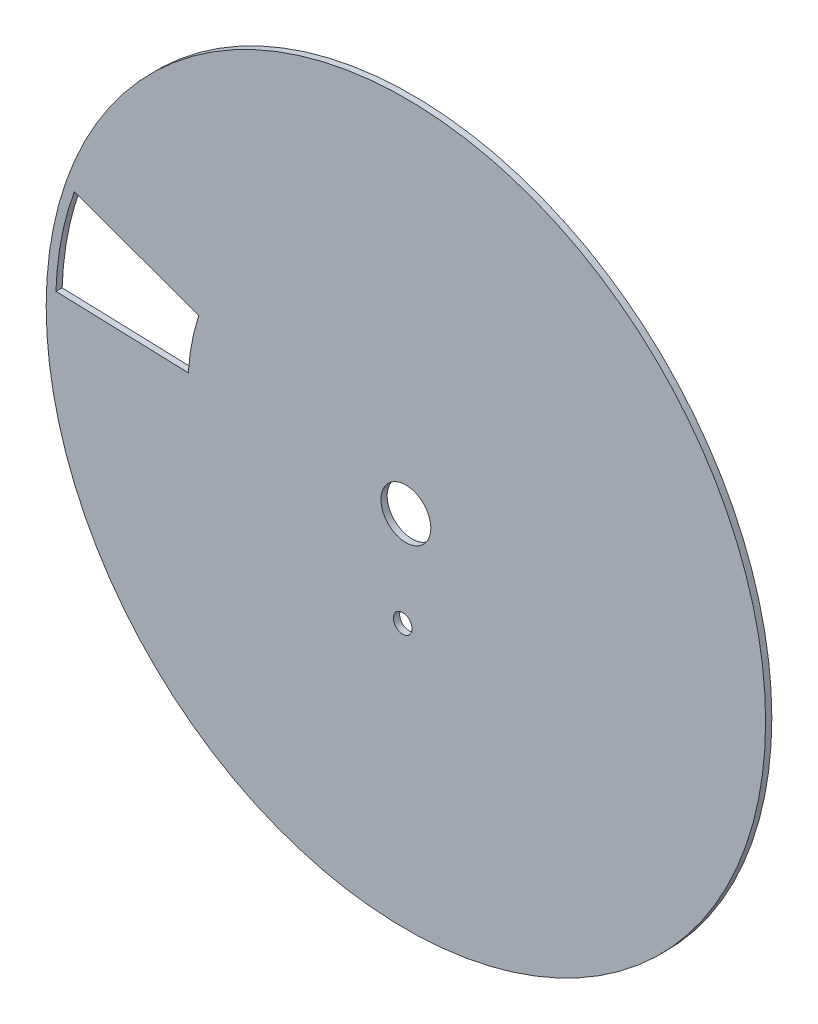
ISO-10303-21;
HEADER;
FILE_DESCRIPTION(('STEP AP214'),'2;1');
FILE_NAME('part.step','',(''),(''),'','','');
FILE_SCHEMA(('AUTOMOTIVE_DESIGN { 1 0 10303 214 1 1 1 1 }'));
ENDSEC;
DATA;
#1=APPLICATION_CONTEXT('core data for automotive mechanical design processes');
#2=APPLICATION_PROTOCOL_DEFINITION('international standard','automotive_design',2000,#1);
#3=PRODUCT_CONTEXT('',#1,'mechanical');
#4=PRODUCT('Part','Part','',(#3));
#5=PRODUCT_RELATED_PRODUCT_CATEGORY('part','',(#4));
#6=PRODUCT_DEFINITION_FORMATION('','',#4);
#7=PRODUCT_DEFINITION_CONTEXT('part definition',#1,'design');
#8=PRODUCT_DEFINITION('design','',#6,#7);
#9=PRODUCT_DEFINITION_SHAPE('','',#8);
#10=(LENGTH_UNIT() NAMED_UNIT(*) SI_UNIT(.MILLI.,.METRE.));
#11=(NAMED_UNIT(*) PLANE_ANGLE_UNIT() SI_UNIT($,.RADIAN.));
#12=(NAMED_UNIT(*) SI_UNIT($,.STERADIAN.) SOLID_ANGLE_UNIT());
#13=UNCERTAINTY_MEASURE_WITH_UNIT(LENGTH_MEASURE(1.E-05),#10,'distance_accuracy_value','');
#14=(GEOMETRIC_REPRESENTATION_CONTEXT(3) GLOBAL_UNCERTAINTY_ASSIGNED_CONTEXT((#13)) GLOBAL_UNIT_ASSIGNED_CONTEXT((#10,
#11,#12)) REPRESENTATION_CONTEXT('',''));
#15=CARTESIAN_POINT('',(0.,0.,0.));
#16=DIRECTION('',(0.,0.,1.));
#17=DIRECTION('',(1.,0.,0.));
#18=AXIS2_PLACEMENT_3D('',#15,#16,#17);
#19=CARTESIAN_POINT('',(0.,0.,1.));
#20=DIRECTION('',(0.,0.,-1.));
#21=DIRECTION('',(-1.,0.,0.));
#22=AXIS2_PLACEMENT_3D('',#19,#20,#21);
#23=CYLINDRICAL_SURFACE('',#22,57.75);
#24=CARTESIAN_POINT('',(0.,0.,1.));
#25=DIRECTION('',(0.,0.,1.));
#26=DIRECTION('',(1.,0.,0.));
#27=AXIS2_PLACEMENT_3D('',#24,#25,#26);
#28=CIRCLE('',#27,57.75);
#29=CARTESIAN_POINT('',(57.75,0.,1.));
#30=VERTEX_POINT('',#29);
#31=EDGE_CURVE('E11',#30,#30,#28,.T.);
#32=ORIENTED_EDGE('',*,*,#31,.F.);
#33=EDGE_LOOP('',(#32));
#34=FACE_BOUND('',#33,.T.);
#35=CARTESIAN_POINT('',(0.,0.,0.));
#36=DIRECTION('',(0.,0.,1.));
#37=DIRECTION('',(1.,0.,0.));
#38=AXIS2_PLACEMENT_3D('',#35,#36,#37);
#39=CIRCLE('',#38,57.75);
#40=CARTESIAN_POINT('',(57.75,0.,0.));
#41=VERTEX_POINT('',#40);
#42=EDGE_CURVE('E43',#41,#41,#39,.T.);
#43=ORIENTED_EDGE('',*,*,#42,.T.);
#44=EDGE_LOOP('',(#43));
#45=FACE_BOUND('',#44,.T.);
#46=ADVANCED_FACE('F35',(#34,#45),#23,.T.);
#47=CARTESIAN_POINT('',(0.,0.,1.));
#48=DIRECTION('',(0.,0.,1.));
#49=DIRECTION('',(1.,0.,0.));
#50=AXIS2_PLACEMENT_3D('',#47,#48,#49);
#51=PLANE('',#50);
#52=CARTESIAN_POINT('',(-0.504599233809029,-15.4957912313643,0.999999999999999));
#53=DIRECTION('',(0.,0.,1.));
#54=DIRECTION('',(1.,0.,0.));
#55=AXIS2_PLACEMENT_3D('',#52,#53,#54);
#56=CIRCLE('',#55,1.5);
#57=CARTESIAN_POINT('',(0.995400766190971,-15.4957912313643,0.999999999999999));
#58=VERTEX_POINT('',#57);
#59=EDGE_CURVE('E148',#58,#58,#56,.T.);
#60=ORIENTED_EDGE('',*,*,#59,.F.);
#61=EDGE_LOOP('',(#60));
#62=FACE_BOUND('',#61,.T.);
#63=CARTESIAN_POINT('',(6.82093270754081E-12,-1.27241966962899E-12,0.999999999999999));
#64=DIRECTION('',(0.,0.,1.));
#65=DIRECTION('',(1.,0.,0.));
#66=AXIS2_PLACEMENT_3D('',#63,#64,#65);
#67=CIRCLE('',#66,35.0000000000069);
#68=CARTESIAN_POINT('',(-34.9346304772887,2.13812848427975,0.999999999999999));
#69=VERTEX_POINT('',#68);
#70=CARTESIAN_POINT('',(-33.2437033861804,10.9478849633919,0.999999999999999));
#71=VERTEX_POINT('',#70);
#72=EDGE_CURVE('E110',#69,#71,#67,.F.);
#73=ORIENTED_EDGE('',*,*,#72,.F.);
#74=DIRECTION('',(0.999470226243168,-0.0325463800357249,0.));
#75=VECTOR('',#74,1.);
#76=CARTESIAN_POINT('',(0.0325463800356788,0.999470226241753,1.));
#77=LINE('',#76,#75);
#78=CARTESIAN_POINT('',(-56.1846304772888,2.83010565138236,1.));
#79=VERTEX_POINT('',#78);
#80=EDGE_CURVE('E103',#79,#69,#77,.T.);
#81=ORIENTED_EDGE('',*,*,#80,.F.);
#82=CARTESIAN_POINT('',(-6.30574227167811,1.17366882078777,0.999999999999999));
#83=DIRECTION('',(0.,0.,1.));
#84=DIRECTION('',(1.,0.,0.));
#85=AXIS2_PLACEMENT_3D('',#82,#83,#84);
#86=CIRCLE('',#85,49.9063850784802);
#87=CARTESIAN_POINT('',(-53.2292282344019,18.1687780204256,0.999999999999999));
#88=VERTEX_POINT('',#87);
#89=EDGE_CURVE('E83',#88,#79,#86,.T.);
#90=ORIENTED_EDGE('',*,*,#89,.F.);
#91=DIRECTION('',(-0.940495286975132,0.339806732095707,0.));
#92=VECTOR('',#91,1.);
#93=CARTESIAN_POINT('',(-0.339806732096038,-0.940495286976048,1.));
#94=LINE('',#93,#92);
#95=EDGE_CURVE('E108',#71,#88,#94,.T.);
#96=ORIENTED_EDGE('',*,*,#95,.F.);
#97=EDGE_LOOP('',(#73,#81,#90,#96));
#98=FACE_BOUND('',#97,.T.);
#99=CARTESIAN_POINT('',(0.,0.,1.));
#100=DIRECTION('',(0.,0.,1.));
#101=DIRECTION('',(1.,0.,0.));
#102=AXIS2_PLACEMENT_3D('',#99,#100,#101);
#103=CIRCLE('',#102,4.00000000000101);
#104=CARTESIAN_POINT('',(4.00000000000101,0.,1.));
#105=VERTEX_POINT('',#104);
#106=EDGE_CURVE('E112',#105,#105,#103,.T.);
#107=ORIENTED_EDGE('',*,*,#106,.F.);
#108=EDGE_LOOP('',(#107));
#109=FACE_BOUND('',#108,.T.);
#110=ORIENTED_EDGE('',*,*,#31,.T.);
#111=EDGE_LOOP('',(#110));
#112=FACE_BOUND('',#111,.T.);
#113=ADVANCED_FACE('F132',(#62,#98,#109,#112),#51,.T.);
#114=CARTESIAN_POINT('',(0.,0.,0.));
#115=DIRECTION('',(0.,0.,1.));
#116=DIRECTION('',(1.,0.,0.));
#117=AXIS2_PLACEMENT_3D('',#114,#115,#116);
#118=PLANE('',#117);
#119=CARTESIAN_POINT('',(-0.504599233809029,-15.4957912313643,0.));
#120=DIRECTION('',(0.,0.,-1.));
#121=DIRECTION('',(-1.,0.,0.));
#122=AXIS2_PLACEMENT_3D('',#119,#120,#121);
#123=CIRCLE('',#122,1.5);
#124=CARTESIAN_POINT('',(-2.00459923380903,-15.4957912313643,0.));
#125=VERTEX_POINT('',#124);
#126=EDGE_CURVE('E155',#125,#125,#123,.T.);
#127=ORIENTED_EDGE('',*,*,#126,.F.);
#128=EDGE_LOOP('',(#127));
#129=FACE_BOUND('',#128,.T.);
#130=DIRECTION('',(-0.999470226243168,0.0325463800357249,0.));
#131=VECTOR('',#130,1.);
#132=CARTESIAN_POINT('',(-34.9346304772887,2.13812848427975,0.));
#133=LINE('',#132,#131);
#134=CARTESIAN_POINT('',(-34.9346304772887,2.13812848427975,0.));
#135=VERTEX_POINT('',#134);
#136=CARTESIAN_POINT('',(-56.1846304772888,2.83010565138236,0.));
#137=VERTEX_POINT('',#136);
#138=EDGE_CURVE('E89',#135,#137,#133,.T.);
#139=ORIENTED_EDGE('',*,*,#138,.F.);
#140=CARTESIAN_POINT('',(6.82093270754081E-12,-1.27241966962899E-12,0.));
#141=DIRECTION('',(0.,0.,1.));
#142=DIRECTION('',(1.,0.,0.));
#143=AXIS2_PLACEMENT_3D('',#140,#141,#142);
#144=CIRCLE('',#143,35.0000000000069);
#145=CARTESIAN_POINT('',(-33.2437033861804,10.9478849633919,0.));
#146=VERTEX_POINT('',#145);
#147=EDGE_CURVE('E59',#146,#135,#144,.T.);
#148=ORIENTED_EDGE('',*,*,#147,.F.);
#149=DIRECTION('',(0.940495286975132,-0.339806732095707,0.));
#150=VECTOR('',#149,1.);
#151=CARTESIAN_POINT('',(-33.2437033861804,10.9478849633919,0.));
#152=LINE('',#151,#150);
#153=CARTESIAN_POINT('',(-53.2292282344019,18.1687780204256,0.));
#154=VERTEX_POINT('',#153);
#155=EDGE_CURVE('E96',#154,#146,#152,.T.);
#156=ORIENTED_EDGE('',*,*,#155,.F.);
#157=CARTESIAN_POINT('',(-6.30574227167811,1.17366882078777,0.));
#158=DIRECTION('',(0.,0.,-1.));
#159=DIRECTION('',(1.,0.,0.));
#160=AXIS2_PLACEMENT_3D('',#157,#158,#159);
#161=CIRCLE('',#160,49.9063850784802);
#162=EDGE_CURVE('E80',#137,#154,#161,.T.);
#163=ORIENTED_EDGE('',*,*,#162,.F.);
#164=EDGE_LOOP('',(#139,#148,#156,#163));
#165=FACE_BOUND('',#164,.T.);
#166=CARTESIAN_POINT('',(0.,0.,0.));
#167=DIRECTION('',(0.,0.,1.));
#168=DIRECTION('',(1.,0.,0.));
#169=AXIS2_PLACEMENT_3D('',#166,#167,#168);
#170=CIRCLE('',#169,4.00000000000101);
#171=CARTESIAN_POINT('',(4.00000000000101,0.,0.));
#172=VERTEX_POINT('',#171);
#173=EDGE_CURVE('E38',#172,#172,#170,.T.);
#174=ORIENTED_EDGE('',*,*,#173,.T.);
#175=EDGE_LOOP('',(#174));
#176=FACE_BOUND('',#175,.T.);
#177=ORIENTED_EDGE('',*,*,#42,.F.);
#178=EDGE_LOOP('',(#177));
#179=FACE_BOUND('',#178,.T.);
#180=ADVANCED_FACE('F93',(#129,#165,#176,#179),#118,.F.);
#181=CARTESIAN_POINT('',(0.,0.,-9.));
#182=DIRECTION('',(0.,0.,1.));
#183=DIRECTION('',(1.,0.,0.));
#184=AXIS2_PLACEMENT_3D('',#181,#182,#183);
#185=CYLINDRICAL_SURFACE('',#184,4.00000000000101);
#186=ORIENTED_EDGE('',*,*,#106,.T.);
#187=EDGE_LOOP('',(#186));
#188=FACE_BOUND('',#187,.T.);
#189=ORIENTED_EDGE('',*,*,#173,.F.);
#190=EDGE_LOOP('',(#189));
#191=FACE_BOUND('',#190,.T.);
#192=ADVANCED_FACE('F121',(#188,#191),#185,.F.);
#193=CARTESIAN_POINT('',(6.82093270754081E-12,-1.27241966962899E-12,10.));
#194=DIRECTION('',(0.,0.,-1.));
#195=DIRECTION('',(-1.,0.,0.));
#196=AXIS2_PLACEMENT_3D('',#193,#194,#195);
#197=CYLINDRICAL_SURFACE('',#196,35.0000000000069);
#198=ORIENTED_EDGE('',*,*,#72,.T.);
#199=DIRECTION('',(0.,0.,-1.));
#200=VECTOR('',#199,1.);
#201=CARTESIAN_POINT('',(-33.2437033861804,10.9478849633919,10.));
#202=LINE('',#201,#200);
#203=EDGE_CURVE('E101',#71,#146,#202,.T.);
#204=ORIENTED_EDGE('',*,*,#203,.T.);
#205=ORIENTED_EDGE('',*,*,#147,.T.);
#206=DIRECTION('',(0.,0.,-1.));
#207=VECTOR('',#206,1.);
#208=CARTESIAN_POINT('',(-34.9346304772887,2.13812848427975,10.));
#209=LINE('',#208,#207);
#210=EDGE_CURVE('E86',#69,#135,#209,.T.);
#211=ORIENTED_EDGE('',*,*,#210,.F.);
#212=EDGE_LOOP('',(#198,#204,#205,#211));
#213=FACE_BOUND('',#212,.T.);
#214=ADVANCED_FACE('F123',(#213),#197,.T.);
#215=CARTESIAN_POINT('',(-33.2437033861804,10.9478849633919,10.));
#216=DIRECTION('',(0.339806732095707,0.940495286975132,0.));
#217=DIRECTION('',(-0.940495286975132,0.339806732095707,0.));
#218=AXIS2_PLACEMENT_3D('',#215,#216,#217);
#219=PLANE('',#218);
#220=ORIENTED_EDGE('',*,*,#95,.T.);
#221=DIRECTION('',(0.,0.,-1.));
#222=VECTOR('',#221,1.);
#223=CARTESIAN_POINT('',(-53.2292282344019,18.1687780204256,10.));
#224=LINE('',#223,#222);
#225=EDGE_CURVE('E85',#88,#154,#224,.T.);
#226=ORIENTED_EDGE('',*,*,#225,.T.);
#227=ORIENTED_EDGE('',*,*,#155,.T.);
#228=ORIENTED_EDGE('',*,*,#203,.F.);
#229=EDGE_LOOP('',(#220,#226,#227,#228));
#230=FACE_BOUND('',#229,.T.);
#231=ADVANCED_FACE('F130',(#230),#219,.F.);
#232=CARTESIAN_POINT('',(-6.30574227167811,1.17366882078777,10.));
#233=DIRECTION('',(0.,0.,-1.));
#234=DIRECTION('',(-1.,0.,0.));
#235=AXIS2_PLACEMENT_3D('',#232,#233,#234);
#236=CYLINDRICAL_SURFACE('',#235,49.9063850784802);
#237=ORIENTED_EDGE('',*,*,#89,.T.);
#238=DIRECTION('',(0.,0.,-1.));
#239=VECTOR('',#238,1.);
#240=CARTESIAN_POINT('',(-56.1846304772888,2.83010565138236,10.));
#241=LINE('',#240,#239);
#242=EDGE_CURVE('E51',#79,#137,#241,.T.);
#243=ORIENTED_EDGE('',*,*,#242,.T.);
#244=ORIENTED_EDGE('',*,*,#162,.T.);
#245=ORIENTED_EDGE('',*,*,#225,.F.);
#246=EDGE_LOOP('',(#237,#243,#244,#245));
#247=FACE_BOUND('',#246,.T.);
#248=ADVANCED_FACE('F77',(#247),#236,.F.);
#249=CARTESIAN_POINT('',(-34.9346304772887,2.13812848427975,10.));
#250=DIRECTION('',(-0.0325463800357249,-0.999470226243168,0.));
#251=DIRECTION('',(0.999470226243168,-0.0325463800357249,0.));
#252=AXIS2_PLACEMENT_3D('',#249,#250,#251);
#253=PLANE('',#252);
#254=ORIENTED_EDGE('',*,*,#80,.T.);
#255=ORIENTED_EDGE('',*,*,#210,.T.);
#256=ORIENTED_EDGE('',*,*,#138,.T.);
#257=ORIENTED_EDGE('',*,*,#242,.F.);
#258=EDGE_LOOP('',(#254,#255,#256,#257));
#259=FACE_BOUND('',#258,.T.);
#260=ADVANCED_FACE('F90',(#259),#253,.F.);
#261=CARTESIAN_POINT('',(-0.504599233809029,-15.4957912313643,10.));
#262=DIRECTION('',(0.,0.,-1.));
#263=DIRECTION('',(-1.,0.,0.));
#264=AXIS2_PLACEMENT_3D('',#261,#262,#263);
#265=CYLINDRICAL_SURFACE('',#264,1.5);
#266=ORIENTED_EDGE('',*,*,#59,.T.);
#267=EDGE_LOOP('',(#266));
#268=FACE_BOUND('',#267,.T.);
#269=ORIENTED_EDGE('',*,*,#126,.T.);
#270=EDGE_LOOP('',(#269));
#271=FACE_BOUND('',#270,.T.);
#272=ADVANCED_FACE('F161',(#268,#271),#265,.F.);
#273=CLOSED_SHELL('',(#46,#113,#180,#192,#214,#231,#248,#260,#272));
#274=MANIFOLD_SOLID_BREP('B2',#273);
#275=ADVANCED_BREP_SHAPE_REPRESENTATION('',(#18,#274),#14);
#276=SHAPE_DEFINITION_REPRESENTATION(#9,#275);
ENDSEC;
END-ISO-10303-21;
